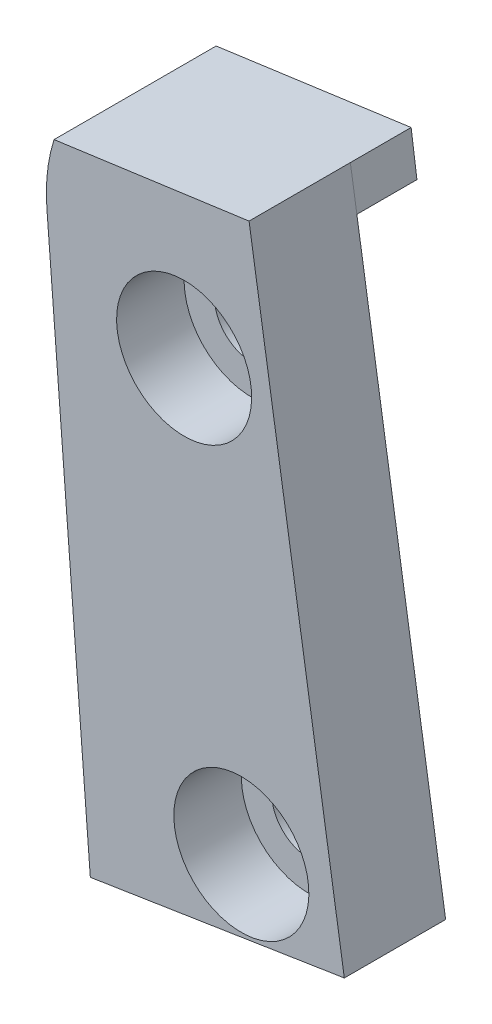
ISO-10303-21;
HEADER;
FILE_DESCRIPTION(('STEP AP214'),'2;1');
FILE_NAME('part.step','',(''),(''),'','','');
FILE_SCHEMA(('AUTOMOTIVE_DESIGN { 1 0 10303 214 1 1 1 1 }'));
ENDSEC;
DATA;
#1=APPLICATION_CONTEXT('core data for automotive mechanical design processes');
#2=APPLICATION_PROTOCOL_DEFINITION('international standard','automotive_design',2000,#1);
#3=PRODUCT_CONTEXT('',#1,'mechanical');
#4=PRODUCT('Part','Part','',(#3));
#5=PRODUCT_RELATED_PRODUCT_CATEGORY('part','',(#4));
#6=PRODUCT_DEFINITION_FORMATION('','',#4);
#7=PRODUCT_DEFINITION_CONTEXT('part definition',#1,'design');
#8=PRODUCT_DEFINITION('design','',#6,#7);
#9=PRODUCT_DEFINITION_SHAPE('','',#8);
#10=(LENGTH_UNIT() NAMED_UNIT(*) SI_UNIT(.MILLI.,.METRE.));
#11=(NAMED_UNIT(*) PLANE_ANGLE_UNIT() SI_UNIT($,.RADIAN.));
#12=(NAMED_UNIT(*) SI_UNIT($,.STERADIAN.) SOLID_ANGLE_UNIT());
#13=UNCERTAINTY_MEASURE_WITH_UNIT(LENGTH_MEASURE(1.E-05),#10,'distance_accuracy_value','');
#14=(GEOMETRIC_REPRESENTATION_CONTEXT(3) GLOBAL_UNCERTAINTY_ASSIGNED_CONTEXT((#13)) GLOBAL_UNIT_ASSIGNED_CONTEXT((#10,
#11,#12)) REPRESENTATION_CONTEXT('',''));
#15=CARTESIAN_POINT('',(0.,0.,0.));
#16=DIRECTION('',(0.,0.,1.));
#17=DIRECTION('',(1.,0.,0.));
#18=AXIS2_PLACEMENT_3D('',#15,#16,#17);
#19=CARTESIAN_POINT('',(8.1042755369268,-6.86793222325922,4.8));
#20=DIRECTION('',(0.,0.,-1.));
#21=DIRECTION('',(0.987935368105614,0.154866744157761,0.));
#22=AXIS2_PLACEMENT_3D('',#19,#20,#21);
#23=CYLINDRICAL_SURFACE('',#22,1.1);
#24=CARTESIAN_POINT('',(8.1042755369268,-6.86793222325922,1.8));
#25=DIRECTION('',(0.,0.,-1.));
#26=DIRECTION('',(-0.987935368105614,-0.154866744157761,0.));
#27=AXIS2_PLACEMENT_3D('',#24,#25,#26);
#28=CIRCLE('',#27,1.1);
#29=CARTESIAN_POINT('',(7.01754663201063,-7.03828564183275,1.8));
#30=VERTEX_POINT('',#29);
#31=EDGE_CURVE('E187',#30,#30,#28,.T.);
#32=ORIENTED_EDGE('',*,*,#31,.T.);
#33=EDGE_LOOP('',(#32));
#34=FACE_BOUND('',#33,.T.);
#35=CARTESIAN_POINT('',(8.1042755369268,-6.86793222325922,2.8));
#36=DIRECTION('',(0.,0.,-1.));
#37=DIRECTION('',(-0.987935368105614,-0.154866744157761,0.));
#38=AXIS2_PLACEMENT_3D('',#35,#36,#37);
#39=CIRCLE('',#38,1.1);
#40=CARTESIAN_POINT('',(7.01754663201063,-7.03828564183275,2.8));
#41=VERTEX_POINT('',#40);
#42=EDGE_CURVE('E44',#41,#41,#39,.T.);
#43=ORIENTED_EDGE('',*,*,#42,.F.);
#44=EDGE_LOOP('',(#43));
#45=FACE_BOUND('',#44,.T.);
#46=ADVANCED_FACE('F41',(#34,#45),#23,.F.);
#47=CARTESIAN_POINT('',(6.40957185133129,5.01179754715341,4.8));
#48=DIRECTION('',(0.,0.,-1.));
#49=DIRECTION('',(0.987935368105614,0.154866744157761,0.));
#50=AXIS2_PLACEMENT_3D('',#47,#48,#49);
#51=CYLINDRICAL_SURFACE('',#50,1.1);
#52=CARTESIAN_POINT('',(6.40957185133129,5.01179754715341,1.8));
#53=DIRECTION('',(0.,0.,-1.));
#54=DIRECTION('',(-0.987935368105614,-0.154866744157761,0.));
#55=AXIS2_PLACEMENT_3D('',#52,#53,#54);
#56=CIRCLE('',#55,1.1);
#57=CARTESIAN_POINT('',(5.32284294641511,4.84144412857987,1.8));
#58=VERTEX_POINT('',#57);
#59=EDGE_CURVE('E185',#58,#58,#56,.T.);
#60=ORIENTED_EDGE('',*,*,#59,.T.);
#61=EDGE_LOOP('',(#60));
#62=FACE_BOUND('',#61,.T.);
#63=CARTESIAN_POINT('',(6.40957185133129,5.01179754715341,2.8));
#64=DIRECTION('',(0.,0.,-1.));
#65=DIRECTION('',(-0.987935368105614,-0.154866744157761,0.));
#66=AXIS2_PLACEMENT_3D('',#63,#64,#65);
#67=CIRCLE('',#66,1.1);
#68=CARTESIAN_POINT('',(5.32284294641511,4.84144412857987,2.8));
#69=VERTEX_POINT('',#68);
#70=EDGE_CURVE('E251',#69,#69,#67,.T.);
#71=ORIENTED_EDGE('',*,*,#70,.F.);
#72=EDGE_LOOP('',(#71));
#73=FACE_BOUND('',#72,.T.);
#74=ADVANCED_FACE('F283',(#62,#73),#51,.F.);
#75=CARTESIAN_POINT('',(7.25692182923709,7.21268442291835,1.8));
#76=DIRECTION('',(0.,0.,-1.));
#77=DIRECTION('',(0.987935368105614,0.154866744157761,0.));
#78=AXIS2_PLACEMENT_3D('',#75,#76,#77);
#79=CYLINDRICAL_SURFACE('',#78,4.92699884637888);
#80=CARTESIAN_POINT('',(7.25692182923709,7.21268442291835,0.));
#81=DIRECTION('',(0.,0.,-1.));
#82=DIRECTION('',(-0.987935368105614,-0.154866744157761,0.));
#83=AXIS2_PLACEMENT_3D('',#80,#81,#82);
#84=CIRCLE('',#83,4.92699884637888);
#85=CARTESIAN_POINT('',(2.34480606853451,6.83001434873438,0.));
#86=VERTEX_POINT('',#85);
#87=CARTESIAN_POINT('',(2.55777632539589,8.6936804276219,0.));
#88=VERTEX_POINT('',#87);
#89=EDGE_CURVE('E212',#86,#88,#84,.T.);
#90=ORIENTED_EDGE('',*,*,#89,.F.);
#91=DIRECTION('',(0.,0.,-1.));
#92=VECTOR('',#91,1.);
#93=CARTESIAN_POINT('',(2.34480606853451,6.83001434873438,1.8));
#94=LINE('',#93,#92);
#95=CARTESIAN_POINT('',(2.34480606853451,6.83001434873438,4.8));
#96=VERTEX_POINT('',#95);
#97=EDGE_CURVE('E217',#96,#86,#94,.T.);
#98=ORIENTED_EDGE('',*,*,#97,.F.);
#99=CARTESIAN_POINT('',(7.25692182923709,7.21268442291835,4.8));
#100=DIRECTION('',(0.,0.,-1.));
#101=DIRECTION('',(-0.987935368105614,-0.154866744157761,0.));
#102=AXIS2_PLACEMENT_3D('',#99,#100,#101);
#103=CIRCLE('',#102,4.92699884637888);
#104=CARTESIAN_POINT('',(2.5577763253959,8.6936804276219,4.8));
#105=VERTEX_POINT('',#104);
#106=EDGE_CURVE('E205',#96,#105,#103,.T.);
#107=ORIENTED_EDGE('',*,*,#106,.T.);
#108=DIRECTION('',(0.,0.,-1.));
#109=VECTOR('',#108,1.);
#110=CARTESIAN_POINT('',(2.55777632539589,8.6936804276219,1.8));
#111=LINE('',#110,#109);
#112=EDGE_CURVE('E11',#105,#88,#111,.T.);
#113=ORIENTED_EDGE('',*,*,#112,.T.);
#114=EDGE_LOOP('',(#90,#98,#107,#113));
#115=FACE_BOUND('',#114,.T.);
#116=ADVANCED_FACE('F43',(#115),#79,.T.);
#117=CARTESIAN_POINT('',(8.33237125811425,9.49117416324836,1.8));
#118=DIRECTION('',(0.136805380219153,-0.990597944649136,0.));
#119=DIRECTION('',(-0.990597944649136,-0.136805380219153,0.));
#120=AXIS2_PLACEMENT_3D('',#117,#118,#119);
#121=PLANE('',#120);
#122=DIRECTION('',(0.990597944649136,0.136805380219153,0.));
#123=VECTOR('',#122,1.);
#124=CARTESIAN_POINT('',(8.33237125811425,9.49117416324836,0.));
#125=LINE('',#124,#123);
#126=CARTESIAN_POINT('',(8.33237125811425,9.49117416324836,0.));
#127=VERTEX_POINT('',#126);
#128=EDGE_CURVE('E225',#88,#127,#125,.T.);
#129=ORIENTED_EDGE('',*,*,#128,.F.);
#130=ORIENTED_EDGE('',*,*,#112,.F.);
#131=DIRECTION('',(0.990597944649136,0.136805380219153,0.));
#132=VECTOR('',#131,1.);
#133=CARTESIAN_POINT('',(8.33237125811425,9.49117416324836,4.8));
#134=LINE('',#133,#132);
#135=CARTESIAN_POINT('',(8.33237125811425,9.49117416324836,4.8));
#136=VERTEX_POINT('',#135);
#137=EDGE_CURVE('E192',#105,#136,#134,.T.);
#138=ORIENTED_EDGE('',*,*,#137,.T.);
#139=DIRECTION('',(0.,0.,-1.));
#140=VECTOR('',#139,1.);
#141=CARTESIAN_POINT('',(8.33237125811425,9.49117416324836,4.8));
#142=LINE('',#141,#140);
#143=CARTESIAN_POINT('',(8.33237125811425,9.49117416324836,1.8));
#144=VERTEX_POINT('',#143);
#145=EDGE_CURVE('E208',#136,#144,#142,.T.);
#146=ORIENTED_EDGE('',*,*,#145,.T.);
#147=DIRECTION('',(0.,0.,-1.));
#148=VECTOR('',#147,1.);
#149=CARTESIAN_POINT('',(8.33237125811425,9.49117416324836,1.8));
#150=LINE('',#149,#148);
#151=EDGE_CURVE('E49',#144,#127,#150,.T.);
#152=ORIENTED_EDGE('',*,*,#151,.T.);
#153=EDGE_LOOP('',(#129,#130,#138,#146,#152));
#154=FACE_BOUND('',#153,.T.);
#155=ADVANCED_FACE('F329',(#154),#121,.F.);
#156=CARTESIAN_POINT('',(8.50514915078128,8.24010183639548,1.8));
#157=DIRECTION('',(-0.990597944649136,-0.136805380219153,0.));
#158=DIRECTION('',(-0.136805380219153,0.990597944649136,0.));
#159=AXIS2_PLACEMENT_3D('',#156,#157,#158);
#160=PLANE('',#159);
#161=DIRECTION('',(0.136805380219153,-0.990597944649136,0.));
#162=VECTOR('',#161,1.);
#163=CARTESIAN_POINT('',(8.50514915078128,8.24010183639548,0.));
#164=LINE('',#163,#162);
#165=CARTESIAN_POINT('',(8.50514915078128,8.24010183639548,0.));
#166=VERTEX_POINT('',#165);
#167=EDGE_CURVE('E224',#127,#166,#164,.T.);
#168=ORIENTED_EDGE('',*,*,#167,.F.);
#169=ORIENTED_EDGE('',*,*,#151,.F.);
#170=DIRECTION('',(0.136805380219153,-0.990597944649136,0.));
#171=VECTOR('',#170,1.);
#172=CARTESIAN_POINT('',(8.50514915078128,8.24010183639548,1.8));
#173=LINE('',#172,#171);
#174=CARTESIAN_POINT('',(8.50514915078128,8.24010183639548,1.8));
#175=VERTEX_POINT('',#174);
#176=EDGE_CURVE('E211',#144,#175,#173,.T.);
#177=ORIENTED_EDGE('',*,*,#176,.T.);
#178=DIRECTION('',(0.,0.,-1.));
#179=VECTOR('',#178,1.);
#180=CARTESIAN_POINT('',(8.50514915078128,8.24010183639548,1.8));
#181=LINE('',#180,#179);
#182=EDGE_CURVE('E250',#175,#166,#181,.T.);
#183=ORIENTED_EDGE('',*,*,#182,.T.);
#184=EDGE_LOOP('',(#168,#169,#177,#183));
#185=FACE_BOUND('',#184,.T.);
#186=ADVANCED_FACE('F324',(#185),#160,.F.);
#187=CARTESIAN_POINT('',(2.63409502569833,7.40256619742078,1.8));
#188=DIRECTION('',(-0.141225307132968,0.989977480867721,0.));
#189=DIRECTION('',(0.989977480867721,0.141225307132968,0.));
#190=AXIS2_PLACEMENT_3D('',#187,#188,#189);
#191=PLANE('',#190);
#192=DIRECTION('',(-0.989977480867721,-0.141225307132968,0.));
#193=VECTOR('',#192,1.);
#194=CARTESIAN_POINT('',(2.63409502569833,7.40256619742078,0.));
#195=LINE('',#194,#193);
#196=CARTESIAN_POINT('',(2.63409502569833,7.40256619742078,0.));
#197=VERTEX_POINT('',#196);
#198=EDGE_CURVE('E228',#166,#197,#195,.T.);
#199=ORIENTED_EDGE('',*,*,#198,.F.);
#200=ORIENTED_EDGE('',*,*,#182,.F.);
#201=DIRECTION('',(-0.989977480867721,-0.141225307132968,0.));
#202=VECTOR('',#201,1.);
#203=CARTESIAN_POINT('',(2.63409502569833,7.40256619742078,1.8));
#204=LINE('',#203,#202);
#205=CARTESIAN_POINT('',(2.63409502569833,7.40256619742078,1.8));
#206=VERTEX_POINT('',#205);
#207=EDGE_CURVE('E218',#175,#206,#204,.T.);
#208=ORIENTED_EDGE('',*,*,#207,.T.);
#209=DIRECTION('',(0.,0.,-1.));
#210=VECTOR('',#209,1.);
#211=CARTESIAN_POINT('',(2.63409502569833,7.40256619742078,1.8));
#212=LINE('',#211,#210);
#213=EDGE_CURVE('E243',#206,#197,#212,.T.);
#214=ORIENTED_EDGE('',*,*,#213,.T.);
#215=EDGE_LOOP('',(#199,#200,#208,#214));
#216=FACE_BOUND('',#215,.T.);
#217=ADVANCED_FACE('F321',(#216),#191,.F.);
#218=CARTESIAN_POINT('',(5.04102091085037,-9.46978106661714,1.8));
#219=DIRECTION('',(-0.989977480867721,-0.141225307132968,0.));
#220=DIRECTION('',(-0.141225307132968,0.989977480867721,0.));
#221=AXIS2_PLACEMENT_3D('',#218,#219,#220);
#222=PLANE('',#221);
#223=DIRECTION('',(0.141225307132968,-0.989977480867721,0.));
#224=VECTOR('',#223,1.);
#225=CARTESIAN_POINT('',(5.04102091085037,-9.46978106661714,0.));
#226=LINE('',#225,#224);
#227=CARTESIAN_POINT('',(5.04102091085037,-9.46978106661714,0.));
#228=VERTEX_POINT('',#227);
#229=EDGE_CURVE('E231',#197,#228,#226,.T.);
#230=ORIENTED_EDGE('',*,*,#229,.F.);
#231=ORIENTED_EDGE('',*,*,#213,.F.);
#232=DIRECTION('',(0.141225307133678,-0.98997748086762,0.));
#233=VECTOR('',#232,1.);
#234=CARTESIAN_POINT('',(2.69106270364957,7.00322758415321,1.8));
#235=LINE('',#234,#233);
#236=CARTESIAN_POINT('',(5.04102091086216,-9.46978106661529,1.8));
#237=VERTEX_POINT('',#236);
#238=EDGE_CURVE('E70',#206,#237,#235,.T.);
#239=ORIENTED_EDGE('',*,*,#238,.T.);
#240=DIRECTION('',(0.,0.,-1.));
#241=VECTOR('',#240,1.);
#242=CARTESIAN_POINT('',(5.04102091085037,-9.46978106661714,1.8));
#243=LINE('',#242,#241);
#244=EDGE_CURVE('E241',#237,#228,#243,.T.);
#245=ORIENTED_EDGE('',*,*,#244,.T.);
#246=EDGE_LOOP('',(#230,#231,#239,#245));
#247=FACE_BOUND('',#246,.T.);
#248=ADVANCED_FACE('F320',(#247),#222,.F.);
#249=CARTESIAN_POINT('',(3.63182314823554,-9.6906840491564,1.8));
#250=DIRECTION('',(-0.154866744157761,0.987935368105614,0.));
#251=DIRECTION('',(0.,0.,1.));
#252=AXIS2_PLACEMENT_3D('',#249,#250,#251);
#253=PLANE('',#252);
#254=DIRECTION('',(-0.987935368105614,-0.154866744157761,0.));
#255=VECTOR('',#254,1.);
#256=CARTESIAN_POINT('',(3.63182314823554,-9.6906840491564,0.));
#257=LINE('',#256,#255);
#258=CARTESIAN_POINT('',(3.63182314823554,-9.6906840491564,0.));
#259=VERTEX_POINT('',#258);
#260=EDGE_CURVE('E233',#228,#259,#257,.T.);
#261=ORIENTED_EDGE('',*,*,#260,.F.);
#262=ORIENTED_EDGE('',*,*,#244,.F.);
#263=DIRECTION('',(-0.987935368105614,-0.154866744157761,0.));
#264=VECTOR('',#263,1.);
#265=CARTESIAN_POINT('',(11.1544270302533,-8.51145592512383,1.8));
#266=LINE('',#265,#264);
#267=CARTESIAN_POINT('',(11.1544270302533,-8.51145592512383,1.8));
#268=VERTEX_POINT('',#267);
#269=EDGE_CURVE('E193',#268,#237,#266,.T.);
#270=ORIENTED_EDGE('',*,*,#269,.F.);
#271=DIRECTION('',(0.,0.,-1.));
#272=VECTOR('',#271,1.);
#273=CARTESIAN_POINT('',(11.1544270302533,-8.51145592512383,4.8));
#274=LINE('',#273,#272);
#275=CARTESIAN_POINT('',(11.1544270302533,-8.51145592512383,4.8));
#276=VERTEX_POINT('',#275);
#277=EDGE_CURVE('E203',#276,#268,#274,.T.);
#278=ORIENTED_EDGE('',*,*,#277,.F.);
#279=DIRECTION('',(-0.987935368105614,-0.154866744157761,0.));
#280=VECTOR('',#279,1.);
#281=CARTESIAN_POINT('',(11.1544270302533,-8.51145592512383,4.8));
#282=LINE('',#281,#280);
#283=CARTESIAN_POINT('',(3.63182314823554,-9.6906840491564,4.8));
#284=VERTEX_POINT('',#283);
#285=EDGE_CURVE('E197',#276,#284,#282,.T.);
#286=ORIENTED_EDGE('',*,*,#285,.T.);
#287=DIRECTION('',(0.,0.,-1.));
#288=VECTOR('',#287,1.);
#289=CARTESIAN_POINT('',(3.63182314823554,-9.6906840491564,1.8));
#290=LINE('',#289,#288);
#291=EDGE_CURVE('E239',#284,#259,#290,.T.);
#292=ORIENTED_EDGE('',*,*,#291,.T.);
#293=EDGE_LOOP('',(#261,#262,#270,#278,#286,#292));
#294=FACE_BOUND('',#293,.T.);
#295=ADVANCED_FACE('F313',(#294),#253,.F.);
#296=CARTESIAN_POINT('',(2.34480606853451,6.83001434873438,1.8));
#297=DIRECTION('',(0.996979279650689,0.077667985342695,0.));
#298=DIRECTION('',(0.077667985342695,-0.996979279650689,0.));
#299=AXIS2_PLACEMENT_3D('',#296,#297,#298);
#300=PLANE('',#299);
#301=DIRECTION('',(-0.077667985342695,0.996979279650689,0.));
#302=VECTOR('',#301,1.);
#303=CARTESIAN_POINT('',(2.34480606853451,6.83001434873438,0.));
#304=LINE('',#303,#302);
#305=EDGE_CURVE('E96',#259,#86,#304,.T.);
#306=ORIENTED_EDGE('',*,*,#305,.F.);
#307=ORIENTED_EDGE('',*,*,#291,.F.);
#308=DIRECTION('',(-0.077667985342695,0.996979279650689,0.));
#309=VECTOR('',#308,1.);
#310=CARTESIAN_POINT('',(3.63182314823554,-9.6906840491564,4.8));
#311=LINE('',#310,#309);
#312=EDGE_CURVE('E200',#284,#96,#311,.T.);
#313=ORIENTED_EDGE('',*,*,#312,.T.);
#314=ORIENTED_EDGE('',*,*,#97,.T.);
#315=EDGE_LOOP('',(#306,#307,#313,#314));
#316=FACE_BOUND('',#315,.T.);
#317=ADVANCED_FACE('F307',(#316),#300,.F.);
#318=CARTESIAN_POINT('',(7.25692182923709,7.21268442291835,0.));
#319=DIRECTION('',(0.,0.,1.));
#320=DIRECTION('',(-0.987935368105614,-0.154866744157761,0.));
#321=AXIS2_PLACEMENT_3D('',#318,#319,#320);
#322=PLANE('',#321);
#323=ORIENTED_EDGE('',*,*,#89,.T.);
#324=ORIENTED_EDGE('',*,*,#128,.T.);
#325=ORIENTED_EDGE('',*,*,#167,.T.);
#326=ORIENTED_EDGE('',*,*,#198,.T.);
#327=ORIENTED_EDGE('',*,*,#229,.T.);
#328=ORIENTED_EDGE('',*,*,#260,.T.);
#329=ORIENTED_EDGE('',*,*,#305,.T.);
#330=EDGE_LOOP('',(#323,#324,#325,#326,#327,#328,#329));
#331=FACE_BOUND('',#330,.T.);
#332=ADVANCED_FACE('F305',(#331),#322,.F.);
#333=CARTESIAN_POINT('',(7.25692182923709,7.21268442291835,1.8));
#334=DIRECTION('',(0.,0.,1.));
#335=DIRECTION('',(-0.987935368105614,-0.154866744157761,0.));
#336=AXIS2_PLACEMENT_3D('',#333,#334,#335);
#337=PLANE('',#336);
#338=DIRECTION('',(0.154866744157761,-0.987935368105614,0.));
#339=VECTOR('',#338,1.);
#340=CARTESIAN_POINT('',(6.81090587920087,-4.64672488833243,1.8));
#341=LINE('',#340,#339);
#342=CARTESIAN_POINT('',(5.70061825660713,2.43608954736628,1.8));
#343=VERTEX_POINT('',#342);
#344=CARTESIAN_POINT('',(6.81090587920087,-4.64672488833243,1.8));
#345=VERTEX_POINT('',#344);
#346=EDGE_CURVE('E159',#343,#345,#341,.T.);
#347=ORIENTED_EDGE('',*,*,#346,.T.);
#348=DIRECTION('',(0.987935368105614,0.154866744157762,0.));
#349=VECTOR('',#348,1.);
#350=CARTESIAN_POINT('',(6.81090587920087,-4.64672488833243,1.8));
#351=LINE('',#350,#349);
#352=CARTESIAN_POINT('',(9.4422920472623,-4.23423413071247,1.8));
#353=VERTEX_POINT('',#352);
#354=EDGE_CURVE('E166',#345,#353,#351,.T.);
#355=ORIENTED_EDGE('',*,*,#354,.T.);
#356=DIRECTION('',(-0.154866744157761,0.987935368105614,0.));
#357=VECTOR('',#356,1.);
#358=CARTESIAN_POINT('',(9.4422920472623,-4.23423413071247,1.8));
#359=LINE('',#358,#357);
#360=CARTESIAN_POINT('',(8.33200442466857,2.84858030498624,1.8));
#361=VERTEX_POINT('',#360);
#362=EDGE_CURVE('E165',#353,#361,#359,.T.);
#363=ORIENTED_EDGE('',*,*,#362,.T.);
#364=DIRECTION('',(-0.987935368105614,-0.154866744157759,0.));
#365=VECTOR('',#364,1.);
#366=CARTESIAN_POINT('',(5.70061825660713,2.43608954736628,1.8));
#367=LINE('',#366,#365);
#368=EDGE_CURVE('E176',#361,#343,#367,.T.);
#369=ORIENTED_EDGE('',*,*,#368,.T.);
#370=EDGE_LOOP('',(#347,#355,#363,#369));
#371=FACE_BOUND('',#370,.T.);
#372=ORIENTED_EDGE('',*,*,#31,.F.);
#373=EDGE_LOOP('',(#372));
#374=FACE_BOUND('',#373,.T.);
#375=ORIENTED_EDGE('',*,*,#59,.F.);
#376=EDGE_LOOP('',(#375));
#377=FACE_BOUND('',#376,.T.);
#378=DIRECTION('',(0.154866744157761,-0.987935368105614,0.));
#379=VECTOR('',#378,1.);
#380=CARTESIAN_POINT('',(8.33237125811425,9.49117416324836,1.8));
#381=LINE('',#380,#379);
#382=EDGE_CURVE('E104',#144,#268,#381,.T.);
#383=ORIENTED_EDGE('',*,*,#382,.T.);
#384=ORIENTED_EDGE('',*,*,#269,.T.);
#385=ORIENTED_EDGE('',*,*,#238,.F.);
#386=ORIENTED_EDGE('',*,*,#207,.F.);
#387=ORIENTED_EDGE('',*,*,#176,.F.);
#388=EDGE_LOOP('',(#383,#384,#385,#386,#387));
#389=FACE_BOUND('',#388,.T.);
#390=ADVANCED_FACE('F300',(#371,#374,#377,#389),#337,.F.);
#391=CARTESIAN_POINT('',(7.25692182923709,7.21268442291835,4.8));
#392=DIRECTION('',(0.,0.,1.));
#393=DIRECTION('',(-0.987935368105614,-0.154866744157761,0.));
#394=AXIS2_PLACEMENT_3D('',#391,#392,#393);
#395=PLANE('',#394);
#396=CARTESIAN_POINT('',(6.40957185133129,5.01179754715341,4.8));
#397=DIRECTION('',(0.,0.,-1.));
#398=DIRECTION('',(-0.987935368105614,-0.154866744157761,0.));
#399=AXIS2_PLACEMENT_3D('',#396,#397,#398);
#400=CIRCLE('',#399,2.);
#401=CARTESIAN_POINT('',(4.43370111512006,4.70206405883789,4.8));
#402=VERTEX_POINT('',#401);
#403=EDGE_CURVE('E256',#402,#402,#400,.T.);
#404=ORIENTED_EDGE('',*,*,#403,.T.);
#405=EDGE_LOOP('',(#404));
#406=FACE_BOUND('',#405,.T.);
#407=CARTESIAN_POINT('',(8.1042755369268,-6.86793222325922,4.8));
#408=DIRECTION('',(0.,0.,-1.));
#409=DIRECTION('',(-0.987935368105614,-0.154866744157761,0.));
#410=AXIS2_PLACEMENT_3D('',#407,#408,#409);
#411=CIRCLE('',#410,2.);
#412=CARTESIAN_POINT('',(6.12840480071558,-7.17766571157474,4.8));
#413=VERTEX_POINT('',#412);
#414=EDGE_CURVE('E261',#413,#413,#411,.T.);
#415=ORIENTED_EDGE('',*,*,#414,.T.);
#416=EDGE_LOOP('',(#415));
#417=FACE_BOUND('',#416,.T.);
#418=ORIENTED_EDGE('',*,*,#137,.F.);
#419=ORIENTED_EDGE('',*,*,#106,.F.);
#420=ORIENTED_EDGE('',*,*,#312,.F.);
#421=ORIENTED_EDGE('',*,*,#285,.F.);
#422=DIRECTION('',(0.154866744157761,-0.987935368105614,0.));
#423=VECTOR('',#422,1.);
#424=CARTESIAN_POINT('',(8.33237125811425,9.49117416324836,4.8));
#425=LINE('',#424,#423);
#426=EDGE_CURVE('E191',#136,#276,#425,.T.);
#427=ORIENTED_EDGE('',*,*,#426,.F.);
#428=EDGE_LOOP('',(#418,#419,#420,#421,#427));
#429=FACE_BOUND('',#428,.T.);
#430=ADVANCED_FACE('F296',(#406,#417,#429),#395,.T.);
#431=CARTESIAN_POINT('',(8.33237125811425,9.49117416324836,4.8));
#432=DIRECTION('',(-0.987935368105614,-0.154866744157761,0.));
#433=DIRECTION('',(0.,0.,-1.));
#434=AXIS2_PLACEMENT_3D('',#431,#432,#433);
#435=PLANE('',#434);
#436=ORIENTED_EDGE('',*,*,#382,.F.);
#437=ORIENTED_EDGE('',*,*,#145,.F.);
#438=ORIENTED_EDGE('',*,*,#426,.T.);
#439=ORIENTED_EDGE('',*,*,#277,.T.);
#440=EDGE_LOOP('',(#436,#437,#438,#439));
#441=FACE_BOUND('',#440,.T.);
#442=ADVANCED_FACE('F298',(#441),#435,.F.);
#443=CARTESIAN_POINT('',(5.70061825660713,2.43608954736628,3.8));
#444=DIRECTION('',(-0.154866744157759,0.987935368105614,0.));
#445=DIRECTION('',(0.987935368105614,0.154866744157759,0.));
#446=AXIS2_PLACEMENT_3D('',#443,#444,#445);
#447=PLANE('',#446);
#448=ORIENTED_EDGE('',*,*,#368,.F.);
#449=DIRECTION('',(0.,0.,-1.));
#450=VECTOR('',#449,1.);
#451=CARTESIAN_POINT('',(8.33200442466857,2.84858030498624,3.8));
#452=LINE('',#451,#450);
#453=CARTESIAN_POINT('',(8.33200442466857,2.84858030498624,3.8));
#454=VERTEX_POINT('',#453);
#455=EDGE_CURVE('E163',#454,#361,#452,.T.);
#456=ORIENTED_EDGE('',*,*,#455,.F.);
#457=DIRECTION('',(-0.987935368105614,-0.154866744157759,0.));
#458=VECTOR('',#457,1.);
#459=CARTESIAN_POINT('',(5.70061825660713,2.43608954736628,3.8));
#460=LINE('',#459,#458);
#461=CARTESIAN_POINT('',(5.70061825660713,2.43608954736628,3.8));
#462=VERTEX_POINT('',#461);
#463=EDGE_CURVE('E148',#454,#462,#460,.T.);
#464=ORIENTED_EDGE('',*,*,#463,.T.);
#465=DIRECTION('',(0.,0.,-1.));
#466=VECTOR('',#465,1.);
#467=CARTESIAN_POINT('',(5.70061825660713,2.43608954736628,3.8));
#468=LINE('',#467,#466);
#469=EDGE_CURVE('E59',#462,#343,#468,.T.);
#470=ORIENTED_EDGE('',*,*,#469,.T.);
#471=EDGE_LOOP('',(#448,#456,#464,#470));
#472=FACE_BOUND('',#471,.T.);
#473=ADVANCED_FACE('F164',(#472),#447,.F.);
#474=CARTESIAN_POINT('',(9.4422920472623,-4.23423413071247,3.8));
#475=DIRECTION('',(0.987935368105614,0.154866744157761,0.));
#476=DIRECTION('',(0.,0.,1.));
#477=AXIS2_PLACEMENT_3D('',#474,#475,#476);
#478=PLANE('',#477);
#479=ORIENTED_EDGE('',*,*,#362,.F.);
#480=DIRECTION('',(0.,0.,-1.));
#481=VECTOR('',#480,1.);
#482=CARTESIAN_POINT('',(9.4422920472623,-4.23423413071247,3.8));
#483=LINE('',#482,#481);
#484=CARTESIAN_POINT('',(9.4422920472623,-4.23423413071247,3.8));
#485=VERTEX_POINT('',#484);
#486=EDGE_CURVE('E183',#485,#353,#483,.T.);
#487=ORIENTED_EDGE('',*,*,#486,.F.);
#488=DIRECTION('',(-0.154866744157761,0.987935368105614,0.));
#489=VECTOR('',#488,1.);
#490=CARTESIAN_POINT('',(9.4422920472623,-4.23423413071247,3.8));
#491=LINE('',#490,#489);
#492=EDGE_CURVE('E161',#485,#454,#491,.T.);
#493=ORIENTED_EDGE('',*,*,#492,.T.);
#494=ORIENTED_EDGE('',*,*,#455,.T.);
#495=EDGE_LOOP('',(#479,#487,#493,#494));
#496=FACE_BOUND('',#495,.T.);
#497=ADVANCED_FACE('F376',(#496),#478,.F.);
#498=CARTESIAN_POINT('',(6.81090587920087,-4.64672488833243,3.8));
#499=DIRECTION('',(0.154866744157762,-0.987935368105614,0.));
#500=DIRECTION('',(-0.987935368105614,-0.154866744157762,0.));
#501=AXIS2_PLACEMENT_3D('',#498,#499,#500);
#502=PLANE('',#501);
#503=ORIENTED_EDGE('',*,*,#354,.F.);
#504=DIRECTION('',(0.,0.,-1.));
#505=VECTOR('',#504,1.);
#506=CARTESIAN_POINT('',(6.81090587920087,-4.64672488833243,3.8));
#507=LINE('',#506,#505);
#508=CARTESIAN_POINT('',(6.81090587920087,-4.64672488833243,3.8));
#509=VERTEX_POINT('',#508);
#510=EDGE_CURVE('E158',#509,#345,#507,.T.);
#511=ORIENTED_EDGE('',*,*,#510,.F.);
#512=DIRECTION('',(0.987935368105614,0.154866744157762,0.));
#513=VECTOR('',#512,1.);
#514=CARTESIAN_POINT('',(6.81090587920087,-4.64672488833243,3.8));
#515=LINE('',#514,#513);
#516=EDGE_CURVE('E152',#509,#485,#515,.T.);
#517=ORIENTED_EDGE('',*,*,#516,.T.);
#518=ORIENTED_EDGE('',*,*,#486,.T.);
#519=EDGE_LOOP('',(#503,#511,#517,#518));
#520=FACE_BOUND('',#519,.T.);
#521=ADVANCED_FACE('F384',(#520),#502,.F.);
#522=CARTESIAN_POINT('',(6.81090587920087,-4.64672488833243,3.8));
#523=DIRECTION('',(-0.987935368105614,-0.154866744157761,0.));
#524=DIRECTION('',(0.,0.,-1.));
#525=AXIS2_PLACEMENT_3D('',#522,#523,#524);
#526=PLANE('',#525);
#527=ORIENTED_EDGE('',*,*,#346,.F.);
#528=ORIENTED_EDGE('',*,*,#469,.F.);
#529=DIRECTION('',(0.154866744157761,-0.987935368105614,0.));
#530=VECTOR('',#529,1.);
#531=CARTESIAN_POINT('',(6.81090587920087,-4.64672488833243,3.8));
#532=LINE('',#531,#530);
#533=EDGE_CURVE('E150',#462,#509,#532,.T.);
#534=ORIENTED_EDGE('',*,*,#533,.T.);
#535=ORIENTED_EDGE('',*,*,#510,.T.);
#536=EDGE_LOOP('',(#527,#528,#534,#535));
#537=FACE_BOUND('',#536,.T.);
#538=ADVANCED_FACE('F160',(#537),#526,.F.);
#539=CARTESIAN_POINT('',(5.71906499972771,0.445534090466155,3.8));
#540=DIRECTION('',(0.,0.,-1.));
#541=DIRECTION('',(0.987935368105614,0.154866744157761,0.));
#542=AXIS2_PLACEMENT_3D('',#539,#540,#541);
#543=PLANE('',#542);
#544=ORIENTED_EDGE('',*,*,#463,.F.);
#545=ORIENTED_EDGE('',*,*,#492,.F.);
#546=ORIENTED_EDGE('',*,*,#516,.F.);
#547=ORIENTED_EDGE('',*,*,#533,.F.);
#548=EDGE_LOOP('',(#544,#545,#546,#547));
#549=FACE_BOUND('',#548,.T.);
#550=ADVANCED_FACE('F149',(#549),#543,.T.);
#551=CARTESIAN_POINT('',(6.40957185133129,5.01179754715341,2.8));
#552=DIRECTION('',(0.,0.,1.));
#553=DIRECTION('',(-0.987935368105614,-0.154866744157761,0.));
#554=AXIS2_PLACEMENT_3D('',#551,#552,#553);
#555=CYLINDRICAL_SURFACE('',#554,2.);
#556=CARTESIAN_POINT('',(6.40957185133129,5.01179754715341,2.8));
#557=DIRECTION('',(0.,0.,-1.));
#558=DIRECTION('',(-0.987935368105614,-0.154866744157761,0.));
#559=AXIS2_PLACEMENT_3D('',#556,#557,#558);
#560=CIRCLE('',#559,2.);
#561=CARTESIAN_POINT('',(4.43370111512006,4.70206405883789,2.8));
#562=VERTEX_POINT('',#561);
#563=EDGE_CURVE('E254',#562,#562,#560,.T.);
#564=ORIENTED_EDGE('',*,*,#563,.T.);
#565=EDGE_LOOP('',(#564));
#566=FACE_BOUND('',#565,.T.);
#567=ORIENTED_EDGE('',*,*,#403,.F.);
#568=EDGE_LOOP('',(#567));
#569=FACE_BOUND('',#568,.T.);
#570=ADVANCED_FACE('F408',(#566,#569),#555,.F.);
#571=CARTESIAN_POINT('',(6.40957185133129,5.01179754715341,2.8));
#572=DIRECTION('',(0.,0.,1.));
#573=DIRECTION('',(-0.987935368105614,-0.154866744157761,0.));
#574=AXIS2_PLACEMENT_3D('',#571,#572,#573);
#575=PLANE('',#574);
#576=ORIENTED_EDGE('',*,*,#70,.T.);
#577=EDGE_LOOP('',(#576));
#578=FACE_BOUND('',#577,.T.);
#579=ORIENTED_EDGE('',*,*,#563,.F.);
#580=EDGE_LOOP('',(#579));
#581=FACE_BOUND('',#580,.T.);
#582=ADVANCED_FACE('F282',(#578,#581),#575,.T.);
#583=CARTESIAN_POINT('',(8.1042755369268,-6.86793222325922,2.8));
#584=DIRECTION('',(0.,0.,1.));
#585=DIRECTION('',(-0.987935368105614,-0.154866744157761,0.));
#586=AXIS2_PLACEMENT_3D('',#583,#584,#585);
#587=CYLINDRICAL_SURFACE('',#586,2.);
#588=CARTESIAN_POINT('',(8.1042755369268,-6.86793222325922,2.8));
#589=DIRECTION('',(0.,0.,-1.));
#590=DIRECTION('',(-0.987935368105614,-0.154866744157761,0.));
#591=AXIS2_PLACEMENT_3D('',#588,#589,#590);
#592=CIRCLE('',#591,2.);
#593=CARTESIAN_POINT('',(6.12840480071558,-7.17766571157474,2.8));
#594=VERTEX_POINT('',#593);
#595=EDGE_CURVE('E173',#594,#594,#592,.T.);
#596=ORIENTED_EDGE('',*,*,#595,.T.);
#597=EDGE_LOOP('',(#596));
#598=FACE_BOUND('',#597,.T.);
#599=ORIENTED_EDGE('',*,*,#414,.F.);
#600=EDGE_LOOP('',(#599));
#601=FACE_BOUND('',#600,.T.);
#602=ADVANCED_FACE('F271',(#598,#601),#587,.F.);
#603=CARTESIAN_POINT('',(8.1042755369268,-6.86793222325922,2.8));
#604=DIRECTION('',(0.,0.,1.));
#605=DIRECTION('',(-0.987935368105614,-0.154866744157761,0.));
#606=AXIS2_PLACEMENT_3D('',#603,#604,#605);
#607=PLANE('',#606);
#608=ORIENTED_EDGE('',*,*,#42,.T.);
#609=EDGE_LOOP('',(#608));
#610=FACE_BOUND('',#609,.T.);
#611=ORIENTED_EDGE('',*,*,#595,.F.);
#612=EDGE_LOOP('',(#611));
#613=FACE_BOUND('',#612,.T.);
#614=ADVANCED_FACE('F272',(#610,#613),#607,.T.);
#615=CLOSED_SHELL('',(#46,#74,#116,#155,#186,#217,#248,#295,#317,#332,#390,#430,#442,#473,#497,
#521,#538,#550,#570,#582,#602,#614));
#616=MANIFOLD_SOLID_BREP('B2',#615);
#617=ADVANCED_BREP_SHAPE_REPRESENTATION('',(#18,#616),#14);
#618=SHAPE_DEFINITION_REPRESENTATION(#9,#617);
ENDSEC;
END-ISO-10303-21;
